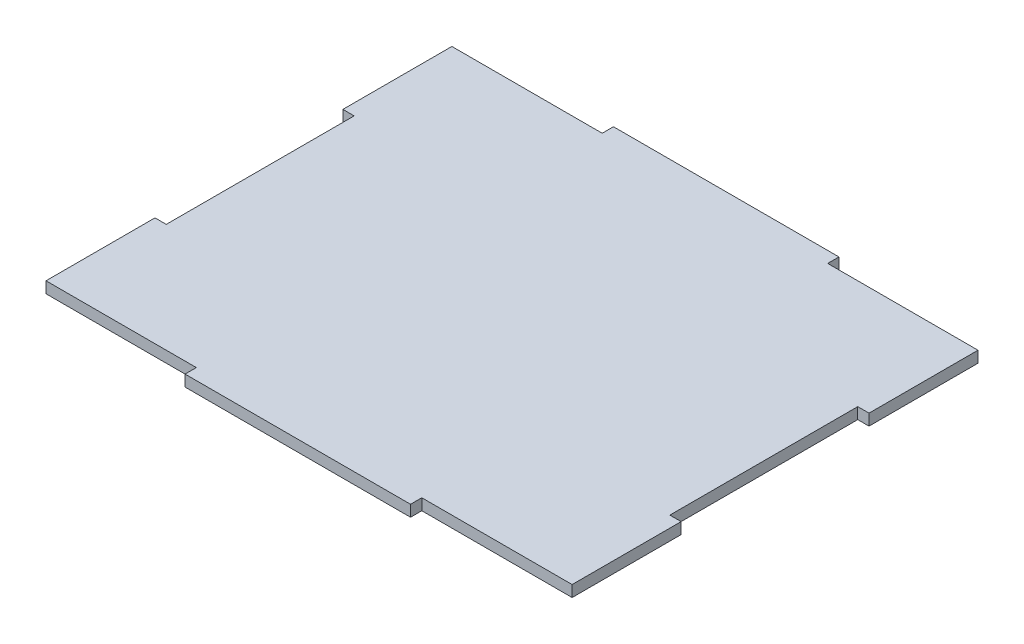
ISO-10303-21;
HEADER;
FILE_DESCRIPTION(('STEP AP214'),'2;1');
FILE_NAME('part.step','',(''),(''),'','','');
FILE_SCHEMA(('AUTOMOTIVE_DESIGN { 1 0 10303 214 1 1 1 1 }'));
ENDSEC;
DATA;
#1=APPLICATION_CONTEXT('core data for automotive mechanical design processes');
#2=APPLICATION_PROTOCOL_DEFINITION('international standard','automotive_design',2000,#1);
#3=PRODUCT_CONTEXT('',#1,'mechanical');
#4=PRODUCT('Part','Part','',(#3));
#5=PRODUCT_RELATED_PRODUCT_CATEGORY('part','',(#4));
#6=PRODUCT_DEFINITION_FORMATION('','',#4);
#7=PRODUCT_DEFINITION_CONTEXT('part definition',#1,'design');
#8=PRODUCT_DEFINITION('design','',#6,#7);
#9=PRODUCT_DEFINITION_SHAPE('','',#8);
#10=(LENGTH_UNIT() NAMED_UNIT(*) SI_UNIT(.MILLI.,.METRE.));
#11=(NAMED_UNIT(*) PLANE_ANGLE_UNIT() SI_UNIT($,.RADIAN.));
#12=(NAMED_UNIT(*) SI_UNIT($,.STERADIAN.) SOLID_ANGLE_UNIT());
#13=UNCERTAINTY_MEASURE_WITH_UNIT(LENGTH_MEASURE(1.E-05),#10,'distance_accuracy_value','');
#14=(GEOMETRIC_REPRESENTATION_CONTEXT(3) GLOBAL_UNCERTAINTY_ASSIGNED_CONTEXT((#13)) GLOBAL_UNIT_ASSIGNED_CONTEXT((#10,
#11,#12)) REPRESENTATION_CONTEXT('',''));
#15=CARTESIAN_POINT('',(0.,0.,0.));
#16=DIRECTION('',(0.,0.,1.));
#17=DIRECTION('',(1.,0.,0.));
#18=AXIS2_PLACEMENT_3D('',#15,#16,#17);
#19=CARTESIAN_POINT('',(40.,3.,-111.));
#20=DIRECTION('',(-1.,0.,0.));
#21=DIRECTION('',(0.,0.,1.));
#22=AXIS2_PLACEMENT_3D('',#19,#20,#21);
#23=PLANE('',#22);
#24=DIRECTION('',(0.,0.,-1.));
#25=VECTOR('',#24,1.);
#26=CARTESIAN_POINT('',(40.,0.,-111.));
#27=LINE('',#26,#25);
#28=CARTESIAN_POINT('',(40.,0.,-111.));
#29=VERTEX_POINT('',#28);
#30=CARTESIAN_POINT('',(40.,0.,-114.));
#31=VERTEX_POINT('',#30);
#32=EDGE_CURVE('E202',#29,#31,#27,.T.);
#33=ORIENTED_EDGE('',*,*,#32,.F.);
#34=DIRECTION('',(0.,-1.,0.));
#35=VECTOR('',#34,1.);
#36=CARTESIAN_POINT('',(40.,3.,-111.));
#37=LINE('',#36,#35);
#38=CARTESIAN_POINT('',(40.,3.,-111.));
#39=VERTEX_POINT('',#38);
#40=EDGE_CURVE('E11',#39,#29,#37,.T.);
#41=ORIENTED_EDGE('',*,*,#40,.F.);
#42=DIRECTION('',(0.,0.,-1.));
#43=VECTOR('',#42,1.);
#44=CARTESIAN_POINT('',(40.,3.,-111.));
#45=LINE('',#44,#43);
#46=CARTESIAN_POINT('',(40.,3.,-114.));
#47=VERTEX_POINT('',#46);
#48=EDGE_CURVE('E252',#39,#47,#45,.T.);
#49=ORIENTED_EDGE('',*,*,#48,.T.);
#50=DIRECTION('',(0.,-1.,0.));
#51=VECTOR('',#50,1.);
#52=CARTESIAN_POINT('',(40.,3.,-114.));
#53=LINE('',#52,#51);
#54=EDGE_CURVE('E38',#47,#31,#53,.T.);
#55=ORIENTED_EDGE('',*,*,#54,.T.);
#56=EDGE_LOOP('',(#33,#41,#49,#55));
#57=FACE_BOUND('',#56,.T.);
#58=ADVANCED_FACE('F35',(#57),#23,.T.);
#59=CARTESIAN_POINT('',(0.,3.,-111.));
#60=DIRECTION('',(0.,0.,-1.));
#61=DIRECTION('',(-1.,0.,0.));
#62=AXIS2_PLACEMENT_3D('',#59,#60,#61);
#63=PLANE('',#62);
#64=DIRECTION('',(1.,0.,0.));
#65=VECTOR('',#64,1.);
#66=CARTESIAN_POINT('',(0.,0.,-111.));
#67=LINE('',#66,#65);
#68=CARTESIAN_POINT('',(0.,0.,-111.));
#69=VERTEX_POINT('',#68);
#70=EDGE_CURVE('E250',#69,#29,#67,.T.);
#71=ORIENTED_EDGE('',*,*,#70,.F.);
#72=DIRECTION('',(0.,-1.,0.));
#73=VECTOR('',#72,1.);
#74=CARTESIAN_POINT('',(0.,3.,-111.));
#75=LINE('',#74,#73);
#76=CARTESIAN_POINT('',(0.,3.,-111.));
#77=VERTEX_POINT('',#76);
#78=EDGE_CURVE('E44',#77,#69,#75,.T.);
#79=ORIENTED_EDGE('',*,*,#78,.F.);
#80=DIRECTION('',(1.,0.,0.));
#81=VECTOR('',#80,1.);
#82=CARTESIAN_POINT('',(0.,3.,-111.));
#83=LINE('',#82,#81);
#84=EDGE_CURVE('E197',#77,#39,#83,.T.);
#85=ORIENTED_EDGE('',*,*,#84,.T.);
#86=ORIENTED_EDGE('',*,*,#40,.T.);
#87=EDGE_LOOP('',(#71,#79,#85,#86));
#88=FACE_BOUND('',#87,.T.);
#89=ADVANCED_FACE('F295',(#88),#63,.T.);
#90=CARTESIAN_POINT('',(0.,3.,-82.));
#91=DIRECTION('',(-1.,0.,0.));
#92=DIRECTION('',(0.,0.,1.));
#93=AXIS2_PLACEMENT_3D('',#90,#91,#92);
#94=PLANE('',#93);
#95=DIRECTION('',(0.,0.,-1.));
#96=VECTOR('',#95,1.);
#97=CARTESIAN_POINT('',(0.,0.,-82.));
#98=LINE('',#97,#96);
#99=CARTESIAN_POINT('',(0.,0.,-82.));
#100=VERTEX_POINT('',#99);
#101=EDGE_CURVE('E182',#100,#69,#98,.T.);
#102=ORIENTED_EDGE('',*,*,#101,.F.);
#103=DIRECTION('',(0.,-1.,0.));
#104=VECTOR('',#103,1.);
#105=CARTESIAN_POINT('',(0.,3.,-82.));
#106=LINE('',#105,#104);
#107=CARTESIAN_POINT('',(0.,3.,-82.));
#108=VERTEX_POINT('',#107);
#109=EDGE_CURVE('E176',#108,#100,#106,.T.);
#110=ORIENTED_EDGE('',*,*,#109,.F.);
#111=DIRECTION('',(0.,0.,-1.));
#112=VECTOR('',#111,1.);
#113=CARTESIAN_POINT('',(0.,3.,-82.));
#114=LINE('',#113,#112);
#115=EDGE_CURVE('E180',#108,#77,#114,.T.);
#116=ORIENTED_EDGE('',*,*,#115,.T.);
#117=ORIENTED_EDGE('',*,*,#78,.T.);
#118=EDGE_LOOP('',(#102,#110,#116,#117));
#119=FACE_BOUND('',#118,.T.);
#120=ADVANCED_FACE('F178',(#119),#94,.T.);
#121=CARTESIAN_POINT('',(0.,3.,-82.));
#122=DIRECTION('',(0.,0.,-1.));
#123=DIRECTION('',(-1.,0.,0.));
#124=AXIS2_PLACEMENT_3D('',#121,#122,#123);
#125=PLANE('',#124);
#126=DIRECTION('',(1.,0.,0.));
#127=VECTOR('',#126,1.);
#128=CARTESIAN_POINT('',(0.,0.,-82.));
#129=LINE('',#128,#127);
#130=CARTESIAN_POINT('',(3.,0.,-82.));
#131=VERTEX_POINT('',#130);
#132=EDGE_CURVE('E247',#100,#131,#129,.T.);
#133=ORIENTED_EDGE('',*,*,#132,.T.);
#134=DIRECTION('',(0.,-1.,0.));
#135=VECTOR('',#134,1.);
#136=CARTESIAN_POINT('',(3.,3.,-82.));
#137=LINE('',#136,#135);
#138=CARTESIAN_POINT('',(3.,3.,-82.));
#139=VERTEX_POINT('',#138);
#140=EDGE_CURVE('E186',#139,#131,#137,.T.);
#141=ORIENTED_EDGE('',*,*,#140,.F.);
#142=DIRECTION('',(1.,0.,0.));
#143=VECTOR('',#142,1.);
#144=CARTESIAN_POINT('',(0.,3.,-82.));
#145=LINE('',#144,#143);
#146=EDGE_CURVE('E189',#108,#139,#145,.T.);
#147=ORIENTED_EDGE('',*,*,#146,.F.);
#148=ORIENTED_EDGE('',*,*,#109,.T.);
#149=EDGE_LOOP('',(#133,#141,#147,#148));
#150=FACE_BOUND('',#149,.T.);
#151=ADVANCED_FACE('F190',(#150),#125,.F.);
#152=CARTESIAN_POINT('',(2.99999999999999,3.,-32.));
#153=DIRECTION('',(-1.,0.,0.));
#154=DIRECTION('',(0.,0.,1.));
#155=AXIS2_PLACEMENT_3D('',#152,#153,#154);
#156=PLANE('',#155);
#157=DIRECTION('',(0.,0.,-1.));
#158=VECTOR('',#157,1.);
#159=CARTESIAN_POINT('',(2.99999999999999,0.,-32.));
#160=LINE('',#159,#158);
#161=CARTESIAN_POINT('',(2.99999999999999,0.,-32.));
#162=VERTEX_POINT('',#161);
#163=EDGE_CURVE('E244',#162,#131,#160,.T.);
#164=ORIENTED_EDGE('',*,*,#163,.F.);
#165=DIRECTION('',(0.,-1.,0.));
#166=VECTOR('',#165,1.);
#167=CARTESIAN_POINT('',(2.99999999999999,3.,-32.));
#168=LINE('',#167,#166);
#169=CARTESIAN_POINT('',(2.99999999999999,3.,-32.));
#170=VERTEX_POINT('',#169);
#171=EDGE_CURVE('E256',#170,#162,#168,.T.);
#172=ORIENTED_EDGE('',*,*,#171,.F.);
#173=DIRECTION('',(0.,0.,-1.));
#174=VECTOR('',#173,1.);
#175=CARTESIAN_POINT('',(2.99999999999999,3.,-32.));
#176=LINE('',#175,#174);
#177=EDGE_CURVE('E194',#170,#139,#176,.T.);
#178=ORIENTED_EDGE('',*,*,#177,.T.);
#179=ORIENTED_EDGE('',*,*,#140,.T.);
#180=EDGE_LOOP('',(#164,#172,#178,#179));
#181=FACE_BOUND('',#180,.T.);
#182=ADVANCED_FACE('F308',(#181),#156,.T.);
#183=CARTESIAN_POINT('',(0.,3.,-32.));
#184=DIRECTION('',(0.,0.,-1.));
#185=DIRECTION('',(-1.,0.,0.));
#186=AXIS2_PLACEMENT_3D('',#183,#184,#185);
#187=PLANE('',#186);
#188=DIRECTION('',(1.,0.,0.));
#189=VECTOR('',#188,1.);
#190=CARTESIAN_POINT('',(0.,0.,-32.));
#191=LINE('',#190,#189);
#192=CARTESIAN_POINT('',(0.,0.,-32.));
#193=VERTEX_POINT('',#192);
#194=EDGE_CURVE('E241',#193,#162,#191,.T.);
#195=ORIENTED_EDGE('',*,*,#194,.F.);
#196=DIRECTION('',(0.,-1.,0.));
#197=VECTOR('',#196,1.);
#198=CARTESIAN_POINT('',(0.,3.,-32.));
#199=LINE('',#198,#197);
#200=CARTESIAN_POINT('',(0.,3.,-32.));
#201=VERTEX_POINT('',#200);
#202=EDGE_CURVE('E258',#201,#193,#199,.T.);
#203=ORIENTED_EDGE('',*,*,#202,.F.);
#204=DIRECTION('',(1.,0.,0.));
#205=VECTOR('',#204,1.);
#206=CARTESIAN_POINT('',(0.,3.,-32.));
#207=LINE('',#206,#205);
#208=EDGE_CURVE('E552',#201,#170,#207,.T.);
#209=ORIENTED_EDGE('',*,*,#208,.T.);
#210=ORIENTED_EDGE('',*,*,#171,.T.);
#211=EDGE_LOOP('',(#195,#203,#209,#210));
#212=FACE_BOUND('',#211,.T.);
#213=ADVANCED_FACE('F311',(#212),#187,.T.);
#214=CARTESIAN_POINT('',(0.,3.,-32.));
#215=DIRECTION('',(1.,0.,0.));
#216=DIRECTION('',(0.,0.,-1.));
#217=AXIS2_PLACEMENT_3D('',#214,#215,#216);
#218=PLANE('',#217);
#219=DIRECTION('',(0.,0.,1.));
#220=VECTOR('',#219,1.);
#221=CARTESIAN_POINT('',(0.,0.,-32.));
#222=LINE('',#221,#220);
#223=CARTESIAN_POINT('',(0.,0.,-3.));
#224=VERTEX_POINT('',#223);
#225=EDGE_CURVE('E239',#193,#224,#222,.T.);
#226=ORIENTED_EDGE('',*,*,#225,.T.);
#227=DIRECTION('',(0.,-1.,0.));
#228=VECTOR('',#227,1.);
#229=CARTESIAN_POINT('',(0.,3.,-3.));
#230=LINE('',#229,#228);
#231=CARTESIAN_POINT('',(0.,3.,-3.));
#232=VERTEX_POINT('',#231);
#233=EDGE_CURVE('E260',#232,#224,#230,.T.);
#234=ORIENTED_EDGE('',*,*,#233,.F.);
#235=DIRECTION('',(0.,0.,1.));
#236=VECTOR('',#235,1.);
#237=CARTESIAN_POINT('',(0.,3.,-32.));
#238=LINE('',#237,#236);
#239=EDGE_CURVE('E547',#201,#232,#238,.T.);
#240=ORIENTED_EDGE('',*,*,#239,.F.);
#241=ORIENTED_EDGE('',*,*,#202,.T.);
#242=EDGE_LOOP('',(#226,#234,#240,#241));
#243=FACE_BOUND('',#242,.T.);
#244=ADVANCED_FACE('F315',(#243),#218,.F.);
#245=CARTESIAN_POINT('',(0.,3.,-3.));
#246=DIRECTION('',(0.,0.,-1.));
#247=DIRECTION('',(-1.,0.,0.));
#248=AXIS2_PLACEMENT_3D('',#245,#246,#247);
#249=PLANE('',#248);
#250=DIRECTION('',(1.,0.,0.));
#251=VECTOR('',#250,1.);
#252=CARTESIAN_POINT('',(0.,0.,-3.));
#253=LINE('',#252,#251);
#254=CARTESIAN_POINT('',(40.,0.,-3.));
#255=VERTEX_POINT('',#254);
#256=EDGE_CURVE('E237',#224,#255,#253,.T.);
#257=ORIENTED_EDGE('',*,*,#256,.T.);
#258=DIRECTION('',(0.,-1.,0.));
#259=VECTOR('',#258,1.);
#260=CARTESIAN_POINT('',(40.,3.,-3.));
#261=LINE('',#260,#259);
#262=CARTESIAN_POINT('',(40.,3.,-3.));
#263=VERTEX_POINT('',#262);
#264=EDGE_CURVE('E263',#263,#255,#261,.T.);
#265=ORIENTED_EDGE('',*,*,#264,.F.);
#266=DIRECTION('',(1.,0.,0.));
#267=VECTOR('',#266,1.);
#268=CARTESIAN_POINT('',(0.,3.,-3.));
#269=LINE('',#268,#267);
#270=EDGE_CURVE('E544',#232,#263,#269,.T.);
#271=ORIENTED_EDGE('',*,*,#270,.F.);
#272=ORIENTED_EDGE('',*,*,#233,.T.);
#273=EDGE_LOOP('',(#257,#265,#271,#272));
#274=FACE_BOUND('',#273,.T.);
#275=ADVANCED_FACE('F319',(#274),#249,.F.);
#276=CARTESIAN_POINT('',(40.,3.,-3.));
#277=DIRECTION('',(1.,0.,0.));
#278=DIRECTION('',(0.,0.,-1.));
#279=AXIS2_PLACEMENT_3D('',#276,#277,#278);
#280=PLANE('',#279);
#281=DIRECTION('',(0.,0.,1.));
#282=VECTOR('',#281,1.);
#283=CARTESIAN_POINT('',(40.,0.,-3.));
#284=LINE('',#283,#282);
#285=CARTESIAN_POINT('',(40.,0.,0.));
#286=VERTEX_POINT('',#285);
#287=EDGE_CURVE('E235',#255,#286,#284,.T.);
#288=ORIENTED_EDGE('',*,*,#287,.T.);
#289=DIRECTION('',(0.,-1.,0.));
#290=VECTOR('',#289,1.);
#291=CARTESIAN_POINT('',(40.,3.,0.));
#292=LINE('',#291,#290);
#293=CARTESIAN_POINT('',(40.,3.,0.));
#294=VERTEX_POINT('',#293);
#295=EDGE_CURVE('E266',#294,#286,#292,.T.);
#296=ORIENTED_EDGE('',*,*,#295,.F.);
#297=DIRECTION('',(0.,0.,1.));
#298=VECTOR('',#297,1.);
#299=CARTESIAN_POINT('',(40.,3.,-3.));
#300=LINE('',#299,#298);
#301=EDGE_CURVE('E542',#263,#294,#300,.T.);
#302=ORIENTED_EDGE('',*,*,#301,.F.);
#303=ORIENTED_EDGE('',*,*,#264,.T.);
#304=EDGE_LOOP('',(#288,#296,#302,#303));
#305=FACE_BOUND('',#304,.T.);
#306=ADVANCED_FACE('F323',(#305),#280,.F.);
#307=CARTESIAN_POINT('',(40.,3.,0.));
#308=DIRECTION('',(0.,0.,-1.));
#309=DIRECTION('',(-1.,0.,0.));
#310=AXIS2_PLACEMENT_3D('',#307,#308,#309);
#311=PLANE('',#310);
#312=DIRECTION('',(1.,0.,0.));
#313=VECTOR('',#312,1.);
#314=CARTESIAN_POINT('',(40.,0.,0.));
#315=LINE('',#314,#313);
#316=CARTESIAN_POINT('',(100.,0.,0.));
#317=VERTEX_POINT('',#316);
#318=EDGE_CURVE('E232',#286,#317,#315,.T.);
#319=ORIENTED_EDGE('',*,*,#318,.T.);
#320=DIRECTION('',(0.,-1.,0.));
#321=VECTOR('',#320,1.);
#322=CARTESIAN_POINT('',(100.,3.,0.));
#323=LINE('',#322,#321);
#324=CARTESIAN_POINT('',(100.,3.,0.));
#325=VERTEX_POINT('',#324);
#326=EDGE_CURVE('E269',#325,#317,#323,.T.);
#327=ORIENTED_EDGE('',*,*,#326,.F.);
#328=DIRECTION('',(1.,0.,0.));
#329=VECTOR('',#328,1.);
#330=CARTESIAN_POINT('',(40.,3.,0.));
#331=LINE('',#330,#329);
#332=EDGE_CURVE('E558',#294,#325,#331,.T.);
#333=ORIENTED_EDGE('',*,*,#332,.F.);
#334=ORIENTED_EDGE('',*,*,#295,.T.);
#335=EDGE_LOOP('',(#319,#327,#333,#334));
#336=FACE_BOUND('',#335,.T.);
#337=ADVANCED_FACE('F327',(#336),#311,.F.);
#338=CARTESIAN_POINT('',(100.,3.,-3.00000000000001));
#339=DIRECTION('',(1.,0.,0.));
#340=DIRECTION('',(0.,0.,-1.));
#341=AXIS2_PLACEMENT_3D('',#338,#339,#340);
#342=PLANE('',#341);
#343=DIRECTION('',(0.,0.,1.));
#344=VECTOR('',#343,1.);
#345=CARTESIAN_POINT('',(100.,0.,-3.00000000000001));
#346=LINE('',#345,#344);
#347=CARTESIAN_POINT('',(100.,0.,-3.00000000000001));
#348=VERTEX_POINT('',#347);
#349=EDGE_CURVE('E229',#348,#317,#346,.T.);
#350=ORIENTED_EDGE('',*,*,#349,.F.);
#351=DIRECTION('',(0.,-1.,0.));
#352=VECTOR('',#351,1.);
#353=CARTESIAN_POINT('',(100.,3.,-3.00000000000001));
#354=LINE('',#353,#352);
#355=CARTESIAN_POINT('',(100.,3.,-3.00000000000001));
#356=VERTEX_POINT('',#355);
#357=EDGE_CURVE('E271',#356,#348,#354,.T.);
#358=ORIENTED_EDGE('',*,*,#357,.F.);
#359=DIRECTION('',(0.,0.,1.));
#360=VECTOR('',#359,1.);
#361=CARTESIAN_POINT('',(100.,3.,-3.00000000000001));
#362=LINE('',#361,#360);
#363=EDGE_CURVE('E534',#356,#325,#362,.T.);
#364=ORIENTED_EDGE('',*,*,#363,.T.);
#365=ORIENTED_EDGE('',*,*,#326,.T.);
#366=EDGE_LOOP('',(#350,#358,#364,#365));
#367=FACE_BOUND('',#366,.T.);
#368=ADVANCED_FACE('F331',(#367),#342,.T.);
#369=CARTESIAN_POINT('',(140.,3.,-3.00000000000002));
#370=DIRECTION('',(0.,0.,1.));
#371=DIRECTION('',(1.,0.,0.));
#372=AXIS2_PLACEMENT_3D('',#369,#370,#371);
#373=PLANE('',#372);
#374=DIRECTION('',(-1.,0.,0.));
#375=VECTOR('',#374,1.);
#376=CARTESIAN_POINT('',(140.,0.,-3.00000000000002));
#377=LINE('',#376,#375);
#378=CARTESIAN_POINT('',(140.,0.,-3.00000000000002));
#379=VERTEX_POINT('',#378);
#380=EDGE_CURVE('E226',#379,#348,#377,.T.);
#381=ORIENTED_EDGE('',*,*,#380,.F.);
#382=DIRECTION('',(0.,-1.,0.));
#383=VECTOR('',#382,1.);
#384=CARTESIAN_POINT('',(140.,3.,-3.00000000000002));
#385=LINE('',#384,#383);
#386=CARTESIAN_POINT('',(140.,3.,-3.00000000000002));
#387=VERTEX_POINT('',#386);
#388=EDGE_CURVE('E273',#387,#379,#385,.T.);
#389=ORIENTED_EDGE('',*,*,#388,.F.);
#390=DIRECTION('',(-1.,0.,0.));
#391=VECTOR('',#390,1.);
#392=CARTESIAN_POINT('',(140.,3.,-3.00000000000002));
#393=LINE('',#392,#391);
#394=EDGE_CURVE('E530',#387,#356,#393,.T.);
#395=ORIENTED_EDGE('',*,*,#394,.T.);
#396=ORIENTED_EDGE('',*,*,#357,.T.);
#397=EDGE_LOOP('',(#381,#389,#395,#396));
#398=FACE_BOUND('',#397,.T.);
#399=ADVANCED_FACE('F335',(#398),#373,.T.);
#400=CARTESIAN_POINT('',(140.,3.,-32.));
#401=DIRECTION('',(1.,0.,0.));
#402=DIRECTION('',(0.,0.,-1.));
#403=AXIS2_PLACEMENT_3D('',#400,#401,#402);
#404=PLANE('',#403);
#405=DIRECTION('',(0.,0.,1.));
#406=VECTOR('',#405,1.);
#407=CARTESIAN_POINT('',(140.,0.,-32.));
#408=LINE('',#407,#406);
#409=CARTESIAN_POINT('',(140.,0.,-32.));
#410=VERTEX_POINT('',#409);
#411=EDGE_CURVE('E223',#410,#379,#408,.T.);
#412=ORIENTED_EDGE('',*,*,#411,.F.);
#413=DIRECTION('',(0.,-1.,0.));
#414=VECTOR('',#413,1.);
#415=CARTESIAN_POINT('',(140.,3.,-32.));
#416=LINE('',#415,#414);
#417=CARTESIAN_POINT('',(140.,3.,-32.));
#418=VERTEX_POINT('',#417);
#419=EDGE_CURVE('E275',#418,#410,#416,.T.);
#420=ORIENTED_EDGE('',*,*,#419,.F.);
#421=DIRECTION('',(0.,0.,1.));
#422=VECTOR('',#421,1.);
#423=CARTESIAN_POINT('',(140.,3.,-32.));
#424=LINE('',#423,#422);
#425=EDGE_CURVE('E524',#418,#387,#424,.T.);
#426=ORIENTED_EDGE('',*,*,#425,.T.);
#427=ORIENTED_EDGE('',*,*,#388,.T.);
#428=EDGE_LOOP('',(#412,#420,#426,#427));
#429=FACE_BOUND('',#428,.T.);
#430=ADVANCED_FACE('F339',(#429),#404,.T.);
#431=CARTESIAN_POINT('',(140.,3.,-32.));
#432=DIRECTION('',(0.,0.,1.));
#433=DIRECTION('',(1.,0.,0.));
#434=AXIS2_PLACEMENT_3D('',#431,#432,#433);
#435=PLANE('',#434);
#436=DIRECTION('',(-1.,0.,0.));
#437=VECTOR('',#436,1.);
#438=CARTESIAN_POINT('',(140.,0.,-32.));
#439=LINE('',#438,#437);
#440=CARTESIAN_POINT('',(137.,0.,-32.));
#441=VERTEX_POINT('',#440);
#442=EDGE_CURVE('E221',#410,#441,#439,.T.);
#443=ORIENTED_EDGE('',*,*,#442,.T.);
#444=DIRECTION('',(0.,-1.,0.));
#445=VECTOR('',#444,1.);
#446=CARTESIAN_POINT('',(137.,3.,-32.));
#447=LINE('',#446,#445);
#448=CARTESIAN_POINT('',(137.,3.,-32.));
#449=VERTEX_POINT('',#448);
#450=EDGE_CURVE('E277',#449,#441,#447,.T.);
#451=ORIENTED_EDGE('',*,*,#450,.F.);
#452=DIRECTION('',(-1.,0.,0.));
#453=VECTOR('',#452,1.);
#454=CARTESIAN_POINT('',(140.,3.,-32.));
#455=LINE('',#454,#453);
#456=EDGE_CURVE('E521',#418,#449,#455,.T.);
#457=ORIENTED_EDGE('',*,*,#456,.F.);
#458=ORIENTED_EDGE('',*,*,#419,.T.);
#459=EDGE_LOOP('',(#443,#451,#457,#458));
#460=FACE_BOUND('',#459,.T.);
#461=ADVANCED_FACE('F343',(#460),#435,.F.);
#462=CARTESIAN_POINT('',(137.,3.,-32.));
#463=DIRECTION('',(-1.,0.,0.));
#464=DIRECTION('',(0.,0.,1.));
#465=AXIS2_PLACEMENT_3D('',#462,#463,#464);
#466=PLANE('',#465);
#467=DIRECTION('',(0.,0.,-1.));
#468=VECTOR('',#467,1.);
#469=CARTESIAN_POINT('',(137.,0.,-32.));
#470=LINE('',#469,#468);
#471=CARTESIAN_POINT('',(137.,0.,-82.));
#472=VERTEX_POINT('',#471);
#473=EDGE_CURVE('E218',#441,#472,#470,.T.);
#474=ORIENTED_EDGE('',*,*,#473,.T.);
#475=DIRECTION('',(0.,-1.,0.));
#476=VECTOR('',#475,1.);
#477=CARTESIAN_POINT('',(137.,3.,-82.));
#478=LINE('',#477,#476);
#479=CARTESIAN_POINT('',(137.,3.,-82.));
#480=VERTEX_POINT('',#479);
#481=EDGE_CURVE('E280',#480,#472,#478,.T.);
#482=ORIENTED_EDGE('',*,*,#481,.F.);
#483=DIRECTION('',(0.,0.,-1.));
#484=VECTOR('',#483,1.);
#485=CARTESIAN_POINT('',(137.,3.,-32.));
#486=LINE('',#485,#484);
#487=EDGE_CURVE('E519',#449,#480,#486,.T.);
#488=ORIENTED_EDGE('',*,*,#487,.F.);
#489=ORIENTED_EDGE('',*,*,#450,.T.);
#490=EDGE_LOOP('',(#474,#482,#488,#489));
#491=FACE_BOUND('',#490,.T.);
#492=ADVANCED_FACE('F347',(#491),#466,.F.);
#493=CARTESIAN_POINT('',(140.,3.,-82.));
#494=DIRECTION('',(0.,0.,1.));
#495=DIRECTION('',(1.,0.,0.));
#496=AXIS2_PLACEMENT_3D('',#493,#494,#495);
#497=PLANE('',#496);
#498=DIRECTION('',(-1.,0.,0.));
#499=VECTOR('',#498,1.);
#500=CARTESIAN_POINT('',(140.,0.,-82.));
#501=LINE('',#500,#499);
#502=CARTESIAN_POINT('',(140.,0.,-82.));
#503=VERTEX_POINT('',#502);
#504=EDGE_CURVE('E215',#503,#472,#501,.T.);
#505=ORIENTED_EDGE('',*,*,#504,.F.);
#506=DIRECTION('',(0.,-1.,0.));
#507=VECTOR('',#506,1.);
#508=CARTESIAN_POINT('',(140.,3.,-82.));
#509=LINE('',#508,#507);
#510=CARTESIAN_POINT('',(140.,3.,-82.));
#511=VERTEX_POINT('',#510);
#512=EDGE_CURVE('E282',#511,#503,#509,.T.);
#513=ORIENTED_EDGE('',*,*,#512,.F.);
#514=DIRECTION('',(-1.,0.,0.));
#515=VECTOR('',#514,1.);
#516=CARTESIAN_POINT('',(140.,3.,-82.));
#517=LINE('',#516,#515);
#518=EDGE_CURVE('E512',#511,#480,#517,.T.);
#519=ORIENTED_EDGE('',*,*,#518,.T.);
#520=ORIENTED_EDGE('',*,*,#481,.T.);
#521=EDGE_LOOP('',(#505,#513,#519,#520));
#522=FACE_BOUND('',#521,.T.);
#523=ADVANCED_FACE('F351',(#522),#497,.T.);
#524=CARTESIAN_POINT('',(140.,3.,-82.));
#525=DIRECTION('',(-1.,0.,0.));
#526=DIRECTION('',(0.,0.,1.));
#527=AXIS2_PLACEMENT_3D('',#524,#525,#526);
#528=PLANE('',#527);
#529=DIRECTION('',(0.,0.,-1.));
#530=VECTOR('',#529,1.);
#531=CARTESIAN_POINT('',(140.,0.,-82.));
#532=LINE('',#531,#530);
#533=CARTESIAN_POINT('',(140.,0.,-111.));
#534=VERTEX_POINT('',#533);
#535=EDGE_CURVE('E213',#503,#534,#532,.T.);
#536=ORIENTED_EDGE('',*,*,#535,.T.);
#537=DIRECTION('',(0.,-1.,0.));
#538=VECTOR('',#537,1.);
#539=CARTESIAN_POINT('',(140.,3.,-111.));
#540=LINE('',#539,#538);
#541=CARTESIAN_POINT('',(140.,3.,-111.));
#542=VERTEX_POINT('',#541);
#543=EDGE_CURVE('E284',#542,#534,#540,.T.);
#544=ORIENTED_EDGE('',*,*,#543,.F.);
#545=DIRECTION('',(0.,0.,-1.));
#546=VECTOR('',#545,1.);
#547=CARTESIAN_POINT('',(140.,3.,-82.));
#548=LINE('',#547,#546);
#549=EDGE_CURVE('E509',#511,#542,#548,.T.);
#550=ORIENTED_EDGE('',*,*,#549,.F.);
#551=ORIENTED_EDGE('',*,*,#512,.T.);
#552=EDGE_LOOP('',(#536,#544,#550,#551));
#553=FACE_BOUND('',#552,.T.);
#554=ADVANCED_FACE('F355',(#553),#528,.F.);
#555=CARTESIAN_POINT('',(140.,3.,-111.));
#556=DIRECTION('',(0.,0.,1.));
#557=DIRECTION('',(1.,0.,0.));
#558=AXIS2_PLACEMENT_3D('',#555,#556,#557);
#559=PLANE('',#558);
#560=DIRECTION('',(-1.,0.,0.));
#561=VECTOR('',#560,1.);
#562=CARTESIAN_POINT('',(140.,0.,-111.));
#563=LINE('',#562,#561);
#564=CARTESIAN_POINT('',(100.,0.,-111.));
#565=VERTEX_POINT('',#564);
#566=EDGE_CURVE('E211',#534,#565,#563,.T.);
#567=ORIENTED_EDGE('',*,*,#566,.T.);
#568=DIRECTION('',(0.,-1.,0.));
#569=VECTOR('',#568,1.);
#570=CARTESIAN_POINT('',(100.,3.,-111.));
#571=LINE('',#570,#569);
#572=CARTESIAN_POINT('',(100.,3.,-111.));
#573=VERTEX_POINT('',#572);
#574=EDGE_CURVE('E287',#573,#565,#571,.T.);
#575=ORIENTED_EDGE('',*,*,#574,.F.);
#576=DIRECTION('',(-1.,0.,0.));
#577=VECTOR('',#576,1.);
#578=CARTESIAN_POINT('',(140.,3.,-111.));
#579=LINE('',#578,#577);
#580=EDGE_CURVE('E507',#542,#573,#579,.T.);
#581=ORIENTED_EDGE('',*,*,#580,.F.);
#582=ORIENTED_EDGE('',*,*,#543,.T.);
#583=EDGE_LOOP('',(#567,#575,#581,#582));
#584=FACE_BOUND('',#583,.T.);
#585=ADVANCED_FACE('F359',(#584),#559,.F.);
#586=CARTESIAN_POINT('',(100.,3.,-111.));
#587=DIRECTION('',(-1.,0.,0.));
#588=DIRECTION('',(0.,0.,1.));
#589=AXIS2_PLACEMENT_3D('',#586,#587,#588);
#590=PLANE('',#589);
#591=DIRECTION('',(0.,0.,-1.));
#592=VECTOR('',#591,1.);
#593=CARTESIAN_POINT('',(100.,0.,-111.));
#594=LINE('',#593,#592);
#595=CARTESIAN_POINT('',(100.,0.,-114.));
#596=VERTEX_POINT('',#595);
#597=EDGE_CURVE('E208',#565,#596,#594,.T.);
#598=ORIENTED_EDGE('',*,*,#597,.T.);
#599=DIRECTION('',(0.,-1.,0.));
#600=VECTOR('',#599,1.);
#601=CARTESIAN_POINT('',(100.,3.,-114.));
#602=LINE('',#601,#600);
#603=CARTESIAN_POINT('',(100.,3.,-114.));
#604=VERTEX_POINT('',#603);
#605=EDGE_CURVE('E289',#604,#596,#602,.T.);
#606=ORIENTED_EDGE('',*,*,#605,.F.);
#607=DIRECTION('',(0.,0.,-1.));
#608=VECTOR('',#607,1.);
#609=CARTESIAN_POINT('',(100.,3.,-111.));
#610=LINE('',#609,#608);
#611=EDGE_CURVE('E568',#573,#604,#610,.T.);
#612=ORIENTED_EDGE('',*,*,#611,.F.);
#613=ORIENTED_EDGE('',*,*,#574,.T.);
#614=EDGE_LOOP('',(#598,#606,#612,#613));
#615=FACE_BOUND('',#614,.T.);
#616=ADVANCED_FACE('F363',(#615),#590,.F.);
#617=CARTESIAN_POINT('',(40.,3.,-114.));
#618=DIRECTION('',(0.,0.,-1.));
#619=DIRECTION('',(-1.,0.,0.));
#620=AXIS2_PLACEMENT_3D('',#617,#618,#619);
#621=PLANE('',#620);
#622=DIRECTION('',(1.,0.,0.));
#623=VECTOR('',#622,1.);
#624=CARTESIAN_POINT('',(40.,0.,-114.));
#625=LINE('',#624,#623);
#626=EDGE_CURVE('E205',#31,#596,#625,.T.);
#627=ORIENTED_EDGE('',*,*,#626,.F.);
#628=ORIENTED_EDGE('',*,*,#54,.F.);
#629=DIRECTION('',(1.,0.,0.));
#630=VECTOR('',#629,1.);
#631=CARTESIAN_POINT('',(40.,3.,-114.));
#632=LINE('',#631,#630);
#633=EDGE_CURVE('E570',#47,#604,#632,.T.);
#634=ORIENTED_EDGE('',*,*,#633,.T.);
#635=ORIENTED_EDGE('',*,*,#605,.T.);
#636=EDGE_LOOP('',(#627,#628,#634,#635));
#637=FACE_BOUND('',#636,.T.);
#638=ADVANCED_FACE('F291',(#637),#621,.T.);
#639=CARTESIAN_POINT('',(0.,3.,0.));
#640=DIRECTION('',(0.,-1.,0.));
#641=DIRECTION('',(0.,0.,-1.));
#642=AXIS2_PLACEMENT_3D('',#639,#640,#641);
#643=PLANE('',#642);
#644=ORIENTED_EDGE('',*,*,#48,.F.);
#645=ORIENTED_EDGE('',*,*,#84,.F.);
#646=ORIENTED_EDGE('',*,*,#115,.F.);
#647=ORIENTED_EDGE('',*,*,#146,.T.);
#648=ORIENTED_EDGE('',*,*,#177,.F.);
#649=ORIENTED_EDGE('',*,*,#208,.F.);
#650=ORIENTED_EDGE('',*,*,#239,.T.);
#651=ORIENTED_EDGE('',*,*,#270,.T.);
#652=ORIENTED_EDGE('',*,*,#301,.T.);
#653=ORIENTED_EDGE('',*,*,#332,.T.);
#654=ORIENTED_EDGE('',*,*,#363,.F.);
#655=ORIENTED_EDGE('',*,*,#394,.F.);
#656=ORIENTED_EDGE('',*,*,#425,.F.);
#657=ORIENTED_EDGE('',*,*,#456,.T.);
#658=ORIENTED_EDGE('',*,*,#487,.T.);
#659=ORIENTED_EDGE('',*,*,#518,.F.);
#660=ORIENTED_EDGE('',*,*,#549,.T.);
#661=ORIENTED_EDGE('',*,*,#580,.T.);
#662=ORIENTED_EDGE('',*,*,#611,.T.);
#663=ORIENTED_EDGE('',*,*,#633,.F.);
#664=EDGE_LOOP('',(#644,#645,#646,#647,#648,#649,#650,#651,#652,#653,#654,#655,#656,#657,#658,
#659,#660,#661,#662,#663));
#665=FACE_BOUND('',#664,.T.);
#666=ADVANCED_FACE('F196',(#665),#643,.F.);
#667=CARTESIAN_POINT('',(0.,0.,0.));
#668=DIRECTION('',(0.,-1.,0.));
#669=DIRECTION('',(0.,0.,-1.));
#670=AXIS2_PLACEMENT_3D('',#667,#668,#669);
#671=PLANE('',#670);
#672=ORIENTED_EDGE('',*,*,#32,.T.);
#673=ORIENTED_EDGE('',*,*,#626,.T.);
#674=ORIENTED_EDGE('',*,*,#597,.F.);
#675=ORIENTED_EDGE('',*,*,#566,.F.);
#676=ORIENTED_EDGE('',*,*,#535,.F.);
#677=ORIENTED_EDGE('',*,*,#504,.T.);
#678=ORIENTED_EDGE('',*,*,#473,.F.);
#679=ORIENTED_EDGE('',*,*,#442,.F.);
#680=ORIENTED_EDGE('',*,*,#411,.T.);
#681=ORIENTED_EDGE('',*,*,#380,.T.);
#682=ORIENTED_EDGE('',*,*,#349,.T.);
#683=ORIENTED_EDGE('',*,*,#318,.F.);
#684=ORIENTED_EDGE('',*,*,#287,.F.);
#685=ORIENTED_EDGE('',*,*,#256,.F.);
#686=ORIENTED_EDGE('',*,*,#225,.F.);
#687=ORIENTED_EDGE('',*,*,#194,.T.);
#688=ORIENTED_EDGE('',*,*,#163,.T.);
#689=ORIENTED_EDGE('',*,*,#132,.F.);
#690=ORIENTED_EDGE('',*,*,#101,.T.);
#691=ORIENTED_EDGE('',*,*,#70,.T.);
#692=EDGE_LOOP('',(#672,#673,#674,#675,#676,#677,#678,#679,#680,#681,#682,#683,#684,#685,#686,
#687,#688,#689,#690,#691));
#693=FACE_BOUND('',#692,.T.);
#694=ADVANCED_FACE('F294',(#693),#671,.T.);
#695=CLOSED_SHELL('',(#58,#89,#120,#151,#182,#213,#244,#275,#306,#337,#368,#399,#430,#461,#492,
#523,#554,#585,#616,#638,#666,#694));
#696=MANIFOLD_SOLID_BREP('B2',#695);
#697=ADVANCED_BREP_SHAPE_REPRESENTATION('',(#18,#696),#14);
#698=SHAPE_DEFINITION_REPRESENTATION(#9,#697);
ENDSEC;
END-ISO-10303-21;
